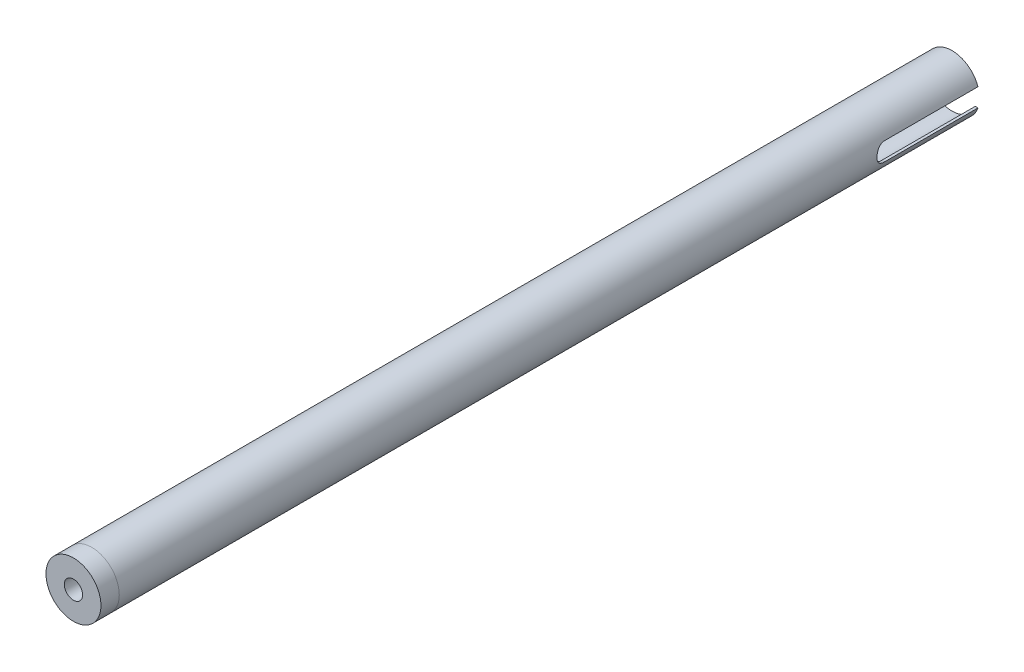
ISO-10303-21;
HEADER;
FILE_DESCRIPTION(('STEP AP214'),'2;1');
FILE_NAME('part.step','',(''),(''),'','','');
FILE_SCHEMA(('AUTOMOTIVE_DESIGN { 1 0 10303 214 1 1 1 1 }'));
ENDSEC;
DATA;
#1=APPLICATION_CONTEXT('core data for automotive mechanical design processes');
#2=APPLICATION_PROTOCOL_DEFINITION('international standard','automotive_design',2000,#1);
#3=PRODUCT_CONTEXT('',#1,'mechanical');
#4=PRODUCT('Part','Part','',(#3));
#5=PRODUCT_RELATED_PRODUCT_CATEGORY('part','',(#4));
#6=PRODUCT_DEFINITION_FORMATION('','',#4);
#7=PRODUCT_DEFINITION_CONTEXT('part definition',#1,'design');
#8=PRODUCT_DEFINITION('design','',#6,#7);
#9=PRODUCT_DEFINITION_SHAPE('','',#8);
#10=(LENGTH_UNIT() NAMED_UNIT(*) SI_UNIT(.MILLI.,.METRE.));
#11=(NAMED_UNIT(*) PLANE_ANGLE_UNIT() SI_UNIT($,.RADIAN.));
#12=(NAMED_UNIT(*) SI_UNIT($,.STERADIAN.) SOLID_ANGLE_UNIT());
#13=UNCERTAINTY_MEASURE_WITH_UNIT(LENGTH_MEASURE(1.E-05),#10,'distance_accuracy_value','');
#14=(GEOMETRIC_REPRESENTATION_CONTEXT(3) GLOBAL_UNCERTAINTY_ASSIGNED_CONTEXT((#13)) GLOBAL_UNIT_ASSIGNED_CONTEXT((#10,
#11,#12)) REPRESENTATION_CONTEXT('',''));
#15=CARTESIAN_POINT('',(0.,0.,0.));
#16=DIRECTION('',(0.,0.,1.));
#17=DIRECTION('',(1.,0.,0.));
#18=AXIS2_PLACEMENT_3D('',#15,#16,#17);
#19=CARTESIAN_POINT('',(0.,0.,-304.380065838685));
#20=DIRECTION('',(0.,0.,1.));
#21=DIRECTION('',(1.,0.,0.));
#22=AXIS2_PLACEMENT_3D('',#19,#20,#21);
#23=CYLINDRICAL_SURFACE('',#22,9.525);
#24=CARTESIAN_POINT('',(0.,0.,-6.35));
#25=DIRECTION('',(0.,0.,1.));
#26=DIRECTION('',(1.,0.,0.));
#27=AXIS2_PLACEMENT_3D('',#24,#25,#26);
#28=CIRCLE('',#27,9.525);
#29=CARTESIAN_POINT('',(9.525,0.,-6.35));
#30=VERTEX_POINT('',#29);
#31=EDGE_CURVE('E175',#30,#30,#28,.T.);
#32=ORIENTED_EDGE('',*,*,#31,.F.);
#33=EDGE_LOOP('',(#32));
#34=FACE_BOUND('',#33,.T.);
#35=CARTESIAN_POINT('',(-8.98025612106915,3.175,-271.995065838685));
#36=CARTESIAN_POINT('',(-8.98024230233901,3.17501142134308,-271.908439735349));
#37=CARTESIAN_POINT('',(-8.98150922759707,3.17145501317748,-271.821821352873));
#38=CARTESIAN_POINT('',(-8.98650170400112,3.1572955094353,-271.649256538048));
#39=CARTESIAN_POINT('',(-8.99022659113085,3.14669431699564,-271.563309930562));
#40=CARTESIAN_POINT('',(-9.00001740508998,3.11857670914845,-271.392955689397));
#41=CARTESIAN_POINT('',(-9.00607621805003,3.10108130380328,-271.30854418759));
#42=CARTESIAN_POINT('',(-9.02033586435304,3.05935434973543,-271.141609386254));
#43=CARTESIAN_POINT('',(-9.02853677497232,3.03512255799513,-271.059086154963));
#44=CARTESIAN_POINT('',(-9.05598792154067,2.95264369348964,-270.815287531686));
#45=CARTESIAN_POINT('',(-9.07810200713862,2.88457148458964,-270.657533947362));
#46=CARTESIAN_POINT('',(-9.127451360236,2.72437908867648,-270.355657428873));
#47=CARTESIAN_POINT('',(-9.15468995097455,2.63224328129309,-270.211543431645));
#48=CARTESIAN_POINT('',(-9.21240416673121,2.42269155952415,-269.93539057182));
#49=CARTESIAN_POINT('',(-9.24296008478943,2.30449853156514,-269.803956989958));
#50=CARTESIAN_POINT('',(-9.30318902123142,2.04784031127147,-269.562361693621));
#51=CARTESIAN_POINT('',(-9.33286185998227,1.90937102786997,-269.452204282389));
#52=CARTESIAN_POINT('',(-9.38892492365177,1.61159672697581,-269.253487270901));
#53=CARTESIAN_POINT('',(-9.41520772598946,1.45183792838573,-269.165575084891));
#54=CARTESIAN_POINT('',(-9.46054712430068,1.11883883316166,-269.018170358821));
#55=CARTESIAN_POINT('',(-9.47961052807859,0.945611424033788,-268.95865103082));
#56=CARTESIAN_POINT('',(-9.50410661247238,0.642992499572375,-268.883172266324));
#57=CARTESIAN_POINT('',(-9.51189798251809,0.515662964136016,-268.859554294281));
#58=CARTESIAN_POINT('',(-9.51973491912187,0.323120458247701,-268.835888028107));
#59=CARTESIAN_POINT('',(-9.52170555244691,0.258670486244991,-268.829959380491));
#60=CARTESIAN_POINT('',(-9.52433958502699,0.12948493034666,-268.822046755824));
#61=CARTESIAN_POINT('',(-9.5250026318504,0.0647492741617728,-268.820063842259));
#62=CARTESIAN_POINT('',(-9.525,0.,-268.820065838685));
#63=B_SPLINE_CURVE_WITH_KNOTS('',3,(#35,#36,#37,#38,#39,#40,#41,#42,#43,#44,#45,#46,#47,#48,#49,
#50,#51,#52,#53,#54,#55,#56,#57,#58,#59,#60,#61,#62),.UNSPECIFIED.,.F.,.F.,(4,2,2,2,2,2,2,2,2,2,
2,2,2,4),(0.,0.259783027985017,0.519495904525443,0.778423354079467,1.0373601457496,
1.55448370709133,2.07194378605916,2.60765740005743,3.14347925237348,3.69345572792671,
4.24291228331228,4.63105001394513,4.82518498412947,5.01937227204625),.UNSPECIFIED.);
#64=CARTESIAN_POINT('',(-8.98025612106915,3.175,-271.995065838685));
#65=VERTEX_POINT('',#64);
#66=CARTESIAN_POINT('',(-9.525,0.,-268.820065838685));
#67=VERTEX_POINT('',#66);
#68=EDGE_CURVE('E209',#65,#67,#63,.T.);
#69=ORIENTED_EDGE('',*,*,#68,.T.);
#70=CARTESIAN_POINT('',(-9.525,0.,-268.820065838685));
#71=CARTESIAN_POINT('',(-9.52501110102584,-0.0867614879611049,-268.820054733648));
#72=CARTESIAN_POINT('',(-9.52381482114642,-0.173516026970688,-268.823621945305));
#73=CARTESIAN_POINT('',(-9.51909010104991,-0.346361025979108,-268.837826783887));
#74=CARTESIAN_POINT('',(-9.51556219632442,-0.432451633867625,-268.848462787364));
#75=CARTESIAN_POINT('',(-9.50626969526085,-0.603121388983434,-268.876679778878));
#76=CARTESIAN_POINT('',(-9.50051134567603,-0.687704073408645,-268.894241373046));
#77=CARTESIAN_POINT('',(-9.48692170416637,-0.854983898510573,-268.936132693684));
#78=CARTESIAN_POINT('',(-9.47909035815865,-0.937680989932473,-268.960462596734));
#79=CARTESIAN_POINT('',(-9.45278540829331,-1.18202731628102,-269.043296989672));
#80=CARTESIAN_POINT('',(-9.43148823554423,-1.3401498669332,-269.111682671018));
#81=CARTESIAN_POINT('',(-9.38354405256208,-1.64264414222568,-269.272609196794));
#82=CARTESIAN_POINT('',(-9.35689419571071,-1.78700848960572,-269.365162901948));
#83=CARTESIAN_POINT('',(-9.30002401422067,-2.06291632995428,-269.575156330153));
#84=CARTESIAN_POINT('',(-9.26971861159363,-2.19392359690275,-269.693278615572));
#85=CARTESIAN_POINT('',(-9.20941732427212,-2.43468689521899,-269.949616592407));
#86=CARTESIAN_POINT('',(-9.1794215361322,-2.54443647619593,-270.087838360565));
#87=CARTESIAN_POINT('',(-9.122187697517,-2.74268087840455,-270.385346339613));
#88=CARTESIAN_POINT('',(-9.09505529775998,-2.83046425019681,-270.545128477686));
#89=CARTESIAN_POINT('',(-9.04794936227173,-2.9776233718293,-270.878172799691));
#90=CARTESIAN_POINT('',(-9.0279682579705,-3.03702917747985,-271.051420494499));
#91=CARTESIAN_POINT('',(-9.00226999890487,-3.1122125650425,-271.353707528494));
#92=CARTESIAN_POINT('',(-8.99408207355733,-3.13569679171672,-271.480669849921));
#93=CARTESIAN_POINT('',(-8.98304472933549,-3.16711304593222,-271.73674702169));
#94=CARTESIAN_POINT('',(-8.98019613476149,-3.17504267212105,-271.865862201292));
#95=CARTESIAN_POINT('',(-8.98025612106915,-3.175,-271.995065838685));
#96=B_SPLINE_CURVE_WITH_KNOTS('',3,(#70,#71,#72,#73,#74,#75,#76,#77,#78,#79,#80,#81,#82,#83,#84,
#85,#86,#87,#88,#89,#90,#91,#92,#93,#94,#95),.UNSPECIFIED.,.F.,.F.,(4,2,2,2,2,2,2,2,2,2,2,2,4),
(0.,0.260191091827307,0.52032244773723,0.77973046721251,1.03914525511038,1.55731822615721,
2.07576750062865,2.61028978360824,3.14497400776474,3.6952175213376,4.24487695078963,
4.63199348452988,5.01916977744542),.UNSPECIFIED.);
#97=CARTESIAN_POINT('',(-8.98025612106916,-3.175,-271.995065838685));
#98=VERTEX_POINT('',#97);
#99=EDGE_CURVE('E151',#67,#98,#96,.T.);
#100=ORIENTED_EDGE('',*,*,#99,.T.);
#101=DIRECTION('',(0.,0.,-1.));
#102=VECTOR('',#101,1.);
#103=CARTESIAN_POINT('',(-8.98025612106916,-3.175,-268.820065838685));
#104=LINE('',#103,#102);
#105=CARTESIAN_POINT('',(-8.98025612106916,-3.175,-304.380065838685));
#106=VERTEX_POINT('',#105);
#107=EDGE_CURVE('E146',#98,#106,#104,.T.);
#108=ORIENTED_EDGE('',*,*,#107,.T.);
#109=CARTESIAN_POINT('',(0.,0.,-304.380065838685));
#110=DIRECTION('',(0.,0.,1.));
#111=DIRECTION('',(1.,0.,0.));
#112=AXIS2_PLACEMENT_3D('',#109,#110,#111);
#113=CIRCLE('',#112,9.525);
#114=CARTESIAN_POINT('',(8.98025612106915,-3.175,-304.380065838685));
#115=VERTEX_POINT('',#114);
#116=EDGE_CURVE('E149',#106,#115,#113,.T.);
#117=ORIENTED_EDGE('',*,*,#116,.T.);
#118=DIRECTION('',(0.,0.,-1.));
#119=VECTOR('',#118,1.);
#120=CARTESIAN_POINT('',(8.98025612106915,-3.175,-268.820065838685));
#121=LINE('',#120,#119);
#122=CARTESIAN_POINT('',(8.98025612106915,-3.175,-271.995065838685));
#123=VERTEX_POINT('',#122);
#124=EDGE_CURVE('E459',#123,#115,#121,.T.);
#125=ORIENTED_EDGE('',*,*,#124,.F.);
#126=CARTESIAN_POINT('',(8.98025612106915,-3.175,-271.995065838685));
#127=CARTESIAN_POINT('',(8.98024230233901,-3.17501142134308,-271.908439735349));
#128=CARTESIAN_POINT('',(8.98150922759707,-3.17145501317748,-271.821821352873));
#129=CARTESIAN_POINT('',(8.98650170400112,-3.1572955094353,-271.649256538048));
#130=CARTESIAN_POINT('',(8.99022659113085,-3.14669431699564,-271.563309930562));
#131=CARTESIAN_POINT('',(9.00001740508998,-3.11857670914845,-271.392955689397));
#132=CARTESIAN_POINT('',(9.00607621805003,-3.10108130380328,-271.30854418759));
#133=CARTESIAN_POINT('',(9.02033586435304,-3.05935434973543,-271.141609386254));
#134=CARTESIAN_POINT('',(9.02853677497232,-3.03512255799513,-271.059086154963));
#135=CARTESIAN_POINT('',(9.05598792154067,-2.95264369348964,-270.815287531686));
#136=CARTESIAN_POINT('',(9.07810200713862,-2.88457148458964,-270.657533947362));
#137=CARTESIAN_POINT('',(9.127451360236,-2.72437908867648,-270.355657428873));
#138=CARTESIAN_POINT('',(9.15468995097455,-2.63224328129309,-270.211543431645));
#139=CARTESIAN_POINT('',(9.21240416673121,-2.42269155952415,-269.93539057182));
#140=CARTESIAN_POINT('',(9.24296008478943,-2.30449853156514,-269.803956989958));
#141=CARTESIAN_POINT('',(9.30318902123142,-2.04784031127147,-269.562361693621));
#142=CARTESIAN_POINT('',(9.33286185998227,-1.90937102786997,-269.452204282389));
#143=CARTESIAN_POINT('',(9.38892492365177,-1.61159672697581,-269.253487270901));
#144=CARTESIAN_POINT('',(9.41520772598946,-1.45183792838573,-269.165575084891));
#145=CARTESIAN_POINT('',(9.46054712430068,-1.11883883316166,-269.018170358821));
#146=CARTESIAN_POINT('',(9.47961052807859,-0.945611424033788,-268.95865103082));
#147=CARTESIAN_POINT('',(9.50410661247238,-0.642992499572375,-268.883172266324));
#148=CARTESIAN_POINT('',(9.51189798251809,-0.515662964136016,-268.859554294281));
#149=CARTESIAN_POINT('',(9.51973491912187,-0.323120458247701,-268.835888028107));
#150=CARTESIAN_POINT('',(9.52170555244691,-0.258670486244991,-268.829959380491));
#151=CARTESIAN_POINT('',(9.52433958502699,-0.12948493034666,-268.822046755824));
#152=CARTESIAN_POINT('',(9.5250026318504,-0.0647492741617728,-268.820063842259));
#153=CARTESIAN_POINT('',(9.525,0.,-268.820065838685));
#154=B_SPLINE_CURVE_WITH_KNOTS('',3,(#126,#127,#128,#129,#130,#131,#132,#133,#134,#135,#136,
#137,#138,#139,#140,#141,#142,#143,#144,#145,#146,#147,#148,#149,#150,#151,#152,#153),
.UNSPECIFIED.,.F.,.F.,(4,2,2,2,2,2,2,2,2,2,2,2,2,4),(0.,0.259783027985017,0.519495904525443,
0.778423354079467,1.0373601457496,1.55448370709133,2.07194378605916,2.60765740005743,
3.14347925237348,3.69345572792671,4.24291228331228,4.63105001394513,4.82518498412947,
5.01937227204625),.UNSPECIFIED.);
#155=CARTESIAN_POINT('',(9.525,0.,-268.820065838685));
#156=VERTEX_POINT('',#155);
#157=EDGE_CURVE('E92',#123,#156,#154,.T.);
#158=ORIENTED_EDGE('',*,*,#157,.T.);
#159=CARTESIAN_POINT('',(9.525,0.,-268.820065838685));
#160=CARTESIAN_POINT('',(9.52501110102584,0.0867614879611049,-268.820054733648));
#161=CARTESIAN_POINT('',(9.52381482114642,0.173516026970688,-268.823621945305));
#162=CARTESIAN_POINT('',(9.51909010104991,0.346361025979108,-268.837826783887));
#163=CARTESIAN_POINT('',(9.51556219632442,0.432451633867625,-268.848462787364));
#164=CARTESIAN_POINT('',(9.50626969526085,0.603121388983434,-268.876679778878));
#165=CARTESIAN_POINT('',(9.50051134567603,0.687704073408645,-268.894241373046));
#166=CARTESIAN_POINT('',(9.48692170416637,0.854983898510573,-268.936132693684));
#167=CARTESIAN_POINT('',(9.47909035815865,0.937680989932473,-268.960462596734));
#168=CARTESIAN_POINT('',(9.45278540829331,1.18202731628102,-269.043296989672));
#169=CARTESIAN_POINT('',(9.43148823554423,1.3401498669332,-269.111682671018));
#170=CARTESIAN_POINT('',(9.38354405256208,1.64264414222568,-269.272609196794));
#171=CARTESIAN_POINT('',(9.35689419571071,1.78700848960572,-269.365162901948));
#172=CARTESIAN_POINT('',(9.30002401422067,2.06291632995428,-269.575156330153));
#173=CARTESIAN_POINT('',(9.26971861159363,2.19392359690275,-269.693278615572));
#174=CARTESIAN_POINT('',(9.20941732427212,2.43468689521899,-269.949616592407));
#175=CARTESIAN_POINT('',(9.1794215361322,2.54443647619593,-270.087838360565));
#176=CARTESIAN_POINT('',(9.122187697517,2.74268087840455,-270.385346339613));
#177=CARTESIAN_POINT('',(9.09505529775998,2.83046425019681,-270.545128477686));
#178=CARTESIAN_POINT('',(9.04794936227173,2.9776233718293,-270.878172799691));
#179=CARTESIAN_POINT('',(9.0279682579705,3.03702917747985,-271.051420494499));
#180=CARTESIAN_POINT('',(9.00226999890487,3.1122125650425,-271.353707528494));
#181=CARTESIAN_POINT('',(8.99408207355733,3.13569679171672,-271.480669849921));
#182=CARTESIAN_POINT('',(8.98304472933549,3.16711304593222,-271.73674702169));
#183=CARTESIAN_POINT('',(8.98019613476149,3.17504267212105,-271.865862201292));
#184=CARTESIAN_POINT('',(8.98025612106915,3.175,-271.995065838685));
#185=B_SPLINE_CURVE_WITH_KNOTS('',3,(#159,#160,#161,#162,#163,#164,#165,#166,#167,#168,#169,
#170,#171,#172,#173,#174,#175,#176,#177,#178,#179,#180,#181,#182,#183,#184),.UNSPECIFIED.,.F.,
.F.,(4,2,2,2,2,2,2,2,2,2,2,2,4),(0.,0.260191091827307,0.52032244773723,0.77973046721251,
1.03914525511038,1.55731822615721,2.07576750062865,2.61028978360824,3.14497400776474,
3.6952175213376,4.24487695078963,4.63199348452988,5.01916977744542),.UNSPECIFIED.);
#186=CARTESIAN_POINT('',(8.98025612106915,3.175,-271.995065838685));
#187=VERTEX_POINT('',#186);
#188=EDGE_CURVE('E78',#156,#187,#185,.T.);
#189=ORIENTED_EDGE('',*,*,#188,.T.);
#190=DIRECTION('',(0.,0.,-1.));
#191=VECTOR('',#190,1.);
#192=CARTESIAN_POINT('',(8.98025612106915,3.175,-268.820065838685));
#193=LINE('',#192,#191);
#194=CARTESIAN_POINT('',(8.98025612106915,3.175,-304.380065838685));
#195=VERTEX_POINT('',#194);
#196=EDGE_CURVE('E167',#187,#195,#193,.T.);
#197=ORIENTED_EDGE('',*,*,#196,.T.);
#198=CARTESIAN_POINT('',(-8.98025612106915,3.175,-304.380065838685));
#199=VERTEX_POINT('',#198);
#200=EDGE_CURVE('E174',#195,#199,#113,.T.);
#201=ORIENTED_EDGE('',*,*,#200,.T.);
#202=DIRECTION('',(0.,0.,-1.));
#203=VECTOR('',#202,1.);
#204=CARTESIAN_POINT('',(-8.98025612106915,3.175,-268.820065838685));
#205=LINE('',#204,#203);
#206=EDGE_CURVE('E448',#65,#199,#205,.T.);
#207=ORIENTED_EDGE('',*,*,#206,.F.);
#208=EDGE_LOOP('',(#69,#100,#108,#117,#125,#158,#189,#197,#201,#207));
#209=FACE_BOUND('',#208,.T.);
#210=ADVANCED_FACE('F67',(#34,#209),#23,.T.);
#211=CARTESIAN_POINT('',(0.,0.,-304.380065838685));
#212=DIRECTION('',(0.,0.,1.));
#213=DIRECTION('',(1.,0.,0.));
#214=AXIS2_PLACEMENT_3D('',#211,#212,#213);
#215=PLANE('',#214);
#216=DIRECTION('',(1.,0.,0.));
#217=VECTOR('',#216,1.);
#218=CARTESIAN_POINT('',(0.,-3.175,-304.380065838685));
#219=LINE('',#218,#217);
#220=CARTESIAN_POINT('',(-8.03118117091129,-3.175,-304.380065838685));
#221=VERTEX_POINT('',#220);
#222=EDGE_CURVE('E159',#106,#221,#219,.T.);
#223=ORIENTED_EDGE('',*,*,#222,.T.);
#224=CARTESIAN_POINT('',(0.,0.,-304.380065838685));
#225=DIRECTION('',(0.,0.,1.));
#226=DIRECTION('',(1.,0.,0.));
#227=AXIS2_PLACEMENT_3D('',#224,#225,#226);
#228=CIRCLE('',#227,8.636);
#229=CARTESIAN_POINT('',(8.03118117091129,-3.175,-304.380065838685));
#230=VERTEX_POINT('',#229);
#231=EDGE_CURVE('E300',#221,#230,#228,.T.);
#232=ORIENTED_EDGE('',*,*,#231,.T.);
#233=DIRECTION('',(1.,0.,0.));
#234=VECTOR('',#233,1.);
#235=CARTESIAN_POINT('',(0.,-3.175,-304.380065838685));
#236=LINE('',#235,#234);
#237=EDGE_CURVE('E172',#230,#115,#236,.T.);
#238=ORIENTED_EDGE('',*,*,#237,.T.);
#239=ORIENTED_EDGE('',*,*,#116,.F.);
#240=EDGE_LOOP('',(#223,#232,#238,#239));
#241=FACE_BOUND('',#240,.T.);
#242=ADVANCED_FACE('F170',(#241),#215,.F.);
#243=CARTESIAN_POINT('',(0.,0.,-304.380065838685));
#244=DIRECTION('',(0.,0.,1.));
#245=DIRECTION('',(1.,0.,0.));
#246=AXIS2_PLACEMENT_3D('',#243,#244,#245);
#247=CYLINDRICAL_SURFACE('',#246,8.636);
#248=CARTESIAN_POINT('',(0.,0.,-6.35));
#249=DIRECTION('',(0.,0.,1.));
#250=DIRECTION('',(1.,0.,0.));
#251=AXIS2_PLACEMENT_3D('',#248,#249,#250);
#252=CIRCLE('',#251,8.636);
#253=CARTESIAN_POINT('',(8.636,0.,-6.35));
#254=VERTEX_POINT('',#253);
#255=EDGE_CURVE('E155',#254,#254,#252,.T.);
#256=ORIENTED_EDGE('',*,*,#255,.T.);
#257=EDGE_LOOP('',(#256));
#258=FACE_BOUND('',#257,.T.);
#259=DIRECTION('',(0.,0.,-1.));
#260=VECTOR('',#259,1.);
#261=CARTESIAN_POINT('',(-8.03118117091129,-3.175,-268.820065838685));
#262=LINE('',#261,#260);
#263=CARTESIAN_POINT('',(-8.03118117091129,-3.175,-271.995065838685));
#264=VERTEX_POINT('',#263);
#265=EDGE_CURVE('E156',#264,#221,#262,.T.);
#266=ORIENTED_EDGE('',*,*,#265,.F.);
#267=CARTESIAN_POINT('',(-8.03118117091129,-3.175,-271.995065838685));
#268=CARTESIAN_POINT('',(-8.03116550357192,-3.17501203663229,-271.909030870569));
#269=CARTESIAN_POINT('',(-8.03256328665432,-3.17150327993899,-271.82300451804));
#270=CARTESIAN_POINT('',(-8.03806891362409,-3.15753809299539,-271.651631947571));
#271=CARTESIAN_POINT('',(-8.04217588089716,-3.14708391007799,-271.566285518665));
#272=CARTESIAN_POINT('',(-8.05296421917626,-3.11937037021479,-271.39717638445));
#273=CARTESIAN_POINT('',(-8.05963650808001,-3.10213501593152,-271.313409173507));
#274=CARTESIAN_POINT('',(-8.07533202922414,-3.06104389654164,-271.147760210739));
#275=CARTESIAN_POINT('',(-8.08435537430867,-3.0371878136549,-271.06587854962));
#276=CARTESIAN_POINT('',(-8.11453837074661,-2.95603278100127,-270.824026392375));
#277=CARTESIAN_POINT('',(-8.13883087950844,-2.88909903597752,-270.6675597548));
#278=CARTESIAN_POINT('',(-8.19300406693486,-2.73167948818753,-270.368024765675));
#279=CARTESIAN_POINT('',(-8.22288931448619,-2.64117440539563,-270.224967513118));
#280=CARTESIAN_POINT('',(-8.28646461334555,-2.43457537576576,-269.94949710388));
#281=CARTESIAN_POINT('',(-8.32026315150129,-2.317546455696,-269.817808731793));
#282=CARTESIAN_POINT('',(-8.38695072719909,-2.06320558041454,-269.5754205534));
#283=CARTESIAN_POINT('',(-8.41983956911545,-1.9258893021522,-269.464725232029));
#284=CARTESIAN_POINT('',(-8.48230406273647,-1.62932475427477,-269.263944117079));
#285=CARTESIAN_POINT('',(-8.5117351959247,-1.46950375402868,-269.174655763574));
#286=CARTESIAN_POINT('',(-8.56262575627031,-1.13591027783605,-269.02459361061));
#287=CARTESIAN_POINT('',(-8.58409342507971,-0.962152453429211,-268.96379031379));
#288=CARTESIAN_POINT('',(-8.61197450421744,-0.656412542712579,-268.88586594814));
#289=CARTESIAN_POINT('',(-8.62092967235125,-0.526538210349253,-268.861250163802));
#290=CARTESIAN_POINT('',(-8.62994176115801,-0.33002097693851,-268.836572832086));
#291=CARTESIAN_POINT('',(-8.63220903333296,-0.264206342476355,-268.830388092936));
#292=CARTESIAN_POINT('',(-8.63523992352765,-0.132266265743979,-268.82213287749));
#293=CARTESIAN_POINT('',(-8.6360031097792,-0.0661407396870706,-268.820063582587));
#294=CARTESIAN_POINT('',(-8.636,0.,-268.820065838685));
#295=B_SPLINE_CURVE_WITH_KNOTS('',3,(#267,#268,#269,#270,#271,#272,#273,#274,#275,#276,#277,
#278,#279,#280,#281,#282,#283,#284,#285,#286,#287,#288,#289,#290,#291,#292,#293,#294),
.UNSPECIFIED.,.F.,.F.,(4,2,2,2,2,2,2,2,2,2,2,2,2,4),(0.,0.258007583993629,0.515931725057005,
0.77295101340558,1.02998264023838,1.54317615093284,2.05679075055082,2.59254838663378,
3.128420352877,3.6819142239817,4.23483365719865,4.63113823379683,4.82943692106888,
5.02779252437178),.UNSPECIFIED.);
#296=CARTESIAN_POINT('',(-8.636,0.,-268.820065838685));
#297=VERTEX_POINT('',#296);
#298=EDGE_CURVE('E236',#264,#297,#295,.T.);
#299=ORIENTED_EDGE('',*,*,#298,.T.);
#300=CARTESIAN_POINT('',(-8.636,0.,-268.820065838685));
#301=CARTESIAN_POINT('',(-8.63601200177566,0.0862340545028663,-268.820054264962));
#302=CARTESIAN_POINT('',(-8.63470866649585,0.172460638964016,-268.823578804982));
#303=CARTESIAN_POINT('',(-8.62956076290727,0.344245368623961,-268.837610234612));
#304=CARTESIAN_POINT('',(-8.62571686385256,0.429803683858972,-268.848115285368));
#305=CARTESIAN_POINT('',(-8.61559314175803,0.599377201936824,-268.875974039423));
#306=CARTESIAN_POINT('',(-8.60932102288695,0.683396413719317,-268.893306085279));
#307=CARTESIAN_POINT('',(-8.5945171663722,0.849553539449469,-268.934637308555));
#308=CARTESIAN_POINT('',(-8.58598535382315,0.93169139093483,-268.958636706988));
#309=CARTESIAN_POINT('',(-8.55732464851214,1.17435074221828,-269.040310888426));
#310=CARTESIAN_POINT('',(-8.53411500636261,1.33136171263578,-269.107702209392));
#311=CARTESIAN_POINT('',(-8.48180653117632,1.63181198358795,-269.266193919402));
#312=CARTESIAN_POINT('',(-8.45270389942466,1.77524244193608,-269.357309612439));
#313=CARTESIAN_POINT('',(-8.39029834803106,2.05036661398532,-269.564562730117));
#314=CARTESIAN_POINT('',(-8.35688032192871,2.1814347411356,-269.681497097709));
#315=CARTESIAN_POINT('',(-8.29018507770489,2.42260670191496,-269.935386084166));
#316=CARTESIAN_POINT('',(-8.25690791509208,2.53270290926749,-270.072347953996));
#317=CARTESIAN_POINT('',(-8.19291826363247,2.73277128594141,-270.368513042821));
#318=CARTESIAN_POINT('',(-8.16234475412034,2.82185641770732,-270.528348132258));
#319=CARTESIAN_POINT('',(-8.10906121054024,2.97153048258984,-270.86194347576));
#320=CARTESIAN_POINT('',(-8.08634169503735,3.03215380703845,-271.035686625429));
#321=CARTESIAN_POINT('',(-8.05677760160867,3.10966172606007,-271.340955260242));
#322=CARTESIAN_POINT('',(-8.04725077861386,3.13409804308655,-271.470335979448));
#323=CARTESIAN_POINT('',(-8.03764862425496,3.15860280233702,-271.666143105288));
#324=CARTESIAN_POINT('',(-8.0352292163598,3.16474613160121,-271.731735861594));
#325=CARTESIAN_POINT('',(-8.03199317651195,3.17294655384153,-271.863235813984));
#326=CARTESIAN_POINT('',(-8.03117703985816,3.17500238406813,-271.929143100934));
#327=CARTESIAN_POINT('',(-8.03118117091129,3.175,-271.995065838685));
#328=B_SPLINE_CURVE_WITH_KNOTS('',3,(#300,#301,#302,#303,#304,#305,#306,#307,#308,#309,#310,
#311,#312,#313,#314,#315,#316,#317,#318,#319,#320,#321,#322,#323,#324,#325,#326,#327),
.UNSPECIFIED.,.F.,.F.,(4,2,2,2,2,2,2,2,2,2,2,2,2,4),(0.,0.25860768427724,0.517147271349144,
0.774873208333403,1.03260768960759,1.54734347080468,2.06241212125685,2.59642224394461,
3.13062618611955,3.6844391606936,4.23758121159796,4.63245186558862,4.83009172977028,
5.0277926412787),.UNSPECIFIED.);
#329=CARTESIAN_POINT('',(-8.03118117091129,3.175,-271.995065838685));
#330=VERTEX_POINT('',#329);
#331=EDGE_CURVE('E200',#297,#330,#328,.T.);
#332=ORIENTED_EDGE('',*,*,#331,.T.);
#333=DIRECTION('',(0.,0.,-1.));
#334=VECTOR('',#333,1.);
#335=CARTESIAN_POINT('',(-8.03118117091129,3.175,-268.820065838685));
#336=LINE('',#335,#334);
#337=CARTESIAN_POINT('',(-8.03118117091129,3.175,-304.380065838685));
#338=VERTEX_POINT('',#337);
#339=EDGE_CURVE('E444',#330,#338,#336,.T.);
#340=ORIENTED_EDGE('',*,*,#339,.T.);
#341=CARTESIAN_POINT('',(8.03118117091129,3.175,-304.380065838685));
#342=VERTEX_POINT('',#341);
#343=EDGE_CURVE('E182',#342,#338,#228,.T.);
#344=ORIENTED_EDGE('',*,*,#343,.F.);
#345=DIRECTION('',(0.,0.,-1.));
#346=VECTOR('',#345,1.);
#347=CARTESIAN_POINT('',(8.03118117091129,3.175,-268.820065838685));
#348=LINE('',#347,#346);
#349=CARTESIAN_POINT('',(8.03118117091129,3.175,-271.995065838685));
#350=VERTEX_POINT('',#349);
#351=EDGE_CURVE('E292',#350,#342,#348,.T.);
#352=ORIENTED_EDGE('',*,*,#351,.F.);
#353=CARTESIAN_POINT('',(8.03118117091129,3.175,-271.995065838685));
#354=CARTESIAN_POINT('',(8.03116550357192,3.17501203663229,-271.909030870569));
#355=CARTESIAN_POINT('',(8.03256328665432,3.17150327993899,-271.82300451804));
#356=CARTESIAN_POINT('',(8.03806891362409,3.15753809299539,-271.651631947571));
#357=CARTESIAN_POINT('',(8.04217588089716,3.14708391007799,-271.566285518665));
#358=CARTESIAN_POINT('',(8.05296421917626,3.11937037021479,-271.39717638445));
#359=CARTESIAN_POINT('',(8.05963650808001,3.10213501593152,-271.313409173507));
#360=CARTESIAN_POINT('',(8.07533202922414,3.06104389654164,-271.147760210739));
#361=CARTESIAN_POINT('',(8.08435537430867,3.0371878136549,-271.06587854962));
#362=CARTESIAN_POINT('',(8.11453837074661,2.95603278100127,-270.824026392375));
#363=CARTESIAN_POINT('',(8.13883087950844,2.88909903597752,-270.6675597548));
#364=CARTESIAN_POINT('',(8.19300406693486,2.73167948818753,-270.368024765675));
#365=CARTESIAN_POINT('',(8.22288931448619,2.64117440539563,-270.224967513118));
#366=CARTESIAN_POINT('',(8.28646461334555,2.43457537576576,-269.94949710388));
#367=CARTESIAN_POINT('',(8.32026315150129,2.317546455696,-269.817808731793));
#368=CARTESIAN_POINT('',(8.38695072719909,2.06320558041454,-269.5754205534));
#369=CARTESIAN_POINT('',(8.41983956911545,1.9258893021522,-269.464725232029));
#370=CARTESIAN_POINT('',(8.48230406273647,1.62932475427477,-269.263944117079));
#371=CARTESIAN_POINT('',(8.5117351959247,1.46950375402868,-269.174655763574));
#372=CARTESIAN_POINT('',(8.56262575627031,1.13591027783605,-269.02459361061));
#373=CARTESIAN_POINT('',(8.58409342507971,0.962152453429211,-268.96379031379));
#374=CARTESIAN_POINT('',(8.61197450421744,0.656412542712579,-268.88586594814));
#375=CARTESIAN_POINT('',(8.62092967235125,0.526538210349253,-268.861250163802));
#376=CARTESIAN_POINT('',(8.62994176115801,0.33002097693851,-268.836572832086));
#377=CARTESIAN_POINT('',(8.63220903333296,0.264206342476355,-268.830388092936));
#378=CARTESIAN_POINT('',(8.63523992352765,0.132266265743979,-268.82213287749));
#379=CARTESIAN_POINT('',(8.6360031097792,0.0661407396870706,-268.820063582587));
#380=CARTESIAN_POINT('',(8.636,0.,-268.820065838685));
#381=B_SPLINE_CURVE_WITH_KNOTS('',3,(#353,#354,#355,#356,#357,#358,#359,#360,#361,#362,#363,
#364,#365,#366,#367,#368,#369,#370,#371,#372,#373,#374,#375,#376,#377,#378,#379,#380),
.UNSPECIFIED.,.F.,.F.,(4,2,2,2,2,2,2,2,2,2,2,2,2,4),(0.,0.258007583993629,0.515931725057005,
0.77295101340558,1.02998264023838,1.54317615093284,2.05679075055082,2.59254838663378,
3.128420352877,3.6819142239817,4.23483365719865,4.63113823379683,4.82943692106888,
5.02779252437178),.UNSPECIFIED.);
#382=CARTESIAN_POINT('',(8.636,0.,-268.820065838685));
#383=VERTEX_POINT('',#382);
#384=EDGE_CURVE('E13',#350,#383,#381,.T.);
#385=ORIENTED_EDGE('',*,*,#384,.T.);
#386=CARTESIAN_POINT('',(8.636,0.,-268.820065838685));
#387=CARTESIAN_POINT('',(8.63601200177566,-0.0862340545028663,-268.820054264962));
#388=CARTESIAN_POINT('',(8.63470866649585,-0.172460638964016,-268.823578804982));
#389=CARTESIAN_POINT('',(8.62956076290727,-0.344245368623961,-268.837610234612));
#390=CARTESIAN_POINT('',(8.62571686385256,-0.429803683858972,-268.848115285368));
#391=CARTESIAN_POINT('',(8.61559314175803,-0.599377201936824,-268.875974039423));
#392=CARTESIAN_POINT('',(8.60932102288695,-0.683396413719317,-268.893306085279));
#393=CARTESIAN_POINT('',(8.5945171663722,-0.849553539449469,-268.934637308555));
#394=CARTESIAN_POINT('',(8.58598535382315,-0.93169139093483,-268.958636706988));
#395=CARTESIAN_POINT('',(8.55732464851214,-1.17435074221828,-269.040310888426));
#396=CARTESIAN_POINT('',(8.53411500636261,-1.33136171263578,-269.107702209392));
#397=CARTESIAN_POINT('',(8.48180653117632,-1.63181198358795,-269.266193919402));
#398=CARTESIAN_POINT('',(8.45270389942466,-1.77524244193608,-269.357309612439));
#399=CARTESIAN_POINT('',(8.39029834803106,-2.05036661398532,-269.564562730117));
#400=CARTESIAN_POINT('',(8.35688032192871,-2.1814347411356,-269.681497097709));
#401=CARTESIAN_POINT('',(8.29018507770489,-2.42260670191496,-269.935386084166));
#402=CARTESIAN_POINT('',(8.25690791509208,-2.53270290926749,-270.072347953996));
#403=CARTESIAN_POINT('',(8.19291826363247,-2.73277128594141,-270.368513042821));
#404=CARTESIAN_POINT('',(8.16234475412034,-2.82185641770732,-270.528348132258));
#405=CARTESIAN_POINT('',(8.10906121054024,-2.97153048258984,-270.86194347576));
#406=CARTESIAN_POINT('',(8.08634169503735,-3.03215380703845,-271.035686625429));
#407=CARTESIAN_POINT('',(8.05677760160867,-3.10966172606007,-271.340955260242));
#408=CARTESIAN_POINT('',(8.04725077861386,-3.13409804308655,-271.470335979448));
#409=CARTESIAN_POINT('',(8.03764862425496,-3.15860280233702,-271.666143105288));
#410=CARTESIAN_POINT('',(8.0352292163598,-3.16474613160121,-271.731735861594));
#411=CARTESIAN_POINT('',(8.03199317651195,-3.17294655384153,-271.863235813984));
#412=CARTESIAN_POINT('',(8.03117703985816,-3.17500238406813,-271.929143100934));
#413=CARTESIAN_POINT('',(8.03118117091129,-3.175,-271.995065838685));
#414=B_SPLINE_CURVE_WITH_KNOTS('',3,(#386,#387,#388,#389,#390,#391,#392,#393,#394,#395,#396,
#397,#398,#399,#400,#401,#402,#403,#404,#405,#406,#407,#408,#409,#410,#411,#412,#413),
.UNSPECIFIED.,.F.,.F.,(4,2,2,2,2,2,2,2,2,2,2,2,2,4),(0.,0.25860768427724,0.517147271349144,
0.774873208333403,1.03260768960759,1.54734347080468,2.06241212125685,2.59642224394461,
3.13062618611955,3.6844391606936,4.23758121159796,4.63245186558862,4.83009172977028,
5.0277926412787),.UNSPECIFIED.);
#415=CARTESIAN_POINT('',(8.03118117091129,-3.175,-271.995065838685));
#416=VERTEX_POINT('',#415);
#417=EDGE_CURVE('E254',#383,#416,#414,.T.);
#418=ORIENTED_EDGE('',*,*,#417,.T.);
#419=DIRECTION('',(0.,0.,-1.));
#420=VECTOR('',#419,1.);
#421=CARTESIAN_POINT('',(8.03118117091129,-3.175,-268.820065838685));
#422=LINE('',#421,#420);
#423=EDGE_CURVE('E295',#416,#230,#422,.T.);
#424=ORIENTED_EDGE('',*,*,#423,.T.);
#425=ORIENTED_EDGE('',*,*,#231,.F.);
#426=EDGE_LOOP('',(#266,#299,#332,#340,#344,#352,#385,#418,#424,#425));
#427=FACE_BOUND('',#426,.T.);
#428=ADVANCED_FACE('F216',(#258,#427),#247,.F.);
#429=ORIENTED_EDGE('',*,*,#343,.T.);
#430=DIRECTION('',(1.,0.,0.));
#431=VECTOR('',#430,1.);
#432=CARTESIAN_POINT('',(0.,3.175,-304.380065838685));
#433=LINE('',#432,#431);
#434=EDGE_CURVE('E166',#199,#338,#433,.T.);
#435=ORIENTED_EDGE('',*,*,#434,.F.);
#436=ORIENTED_EDGE('',*,*,#200,.F.);
#437=DIRECTION('',(1.,0.,0.));
#438=VECTOR('',#437,1.);
#439=CARTESIAN_POINT('',(0.,3.175,-304.380065838685));
#440=LINE('',#439,#438);
#441=EDGE_CURVE('E273',#342,#195,#440,.T.);
#442=ORIENTED_EDGE('',*,*,#441,.F.);
#443=EDGE_LOOP('',(#429,#435,#436,#442));
#444=FACE_BOUND('',#443,.T.);
#445=ADVANCED_FACE('F313',(#444),#215,.F.);
#446=CARTESIAN_POINT('',(0.,0.,-6.35));
#447=DIRECTION('',(0.,0.,1.));
#448=DIRECTION('',(1.,0.,0.));
#449=AXIS2_PLACEMENT_3D('',#446,#447,#448);
#450=PLANE('',#449);
#451=ORIENTED_EDGE('',*,*,#255,.F.);
#452=EDGE_LOOP('',(#451));
#453=FACE_BOUND('',#452,.T.);
#454=ORIENTED_EDGE('',*,*,#31,.T.);
#455=EDGE_LOOP('',(#454));
#456=FACE_BOUND('',#455,.T.);
#457=ADVANCED_FACE('F310',(#453,#456),#450,.T.);
#458=CARTESIAN_POINT('',(0.,3.175,-268.820065838685));
#459=DIRECTION('',(0.,1.,0.));
#460=DIRECTION('',(0.,0.,1.));
#461=AXIS2_PLACEMENT_3D('',#458,#459,#460);
#462=PLANE('',#461);
#463=ORIENTED_EDGE('',*,*,#196,.F.);
#464=DIRECTION('',(1.,0.,0.));
#465=VECTOR('',#464,1.);
#466=CARTESIAN_POINT('',(8.03118117091129,3.175,-271.995065838685));
#467=LINE('',#466,#465);
#468=EDGE_CURVE('E197',#187,#350,#467,.F.);
#469=ORIENTED_EDGE('',*,*,#468,.T.);
#470=ORIENTED_EDGE('',*,*,#351,.T.);
#471=ORIENTED_EDGE('',*,*,#441,.T.);
#472=EDGE_LOOP('',(#463,#469,#470,#471));
#473=FACE_BOUND('',#472,.T.);
#474=ADVANCED_FACE('F288',(#473),#462,.F.);
#475=CARTESIAN_POINT('',(0.,-3.175,-268.820065838685));
#476=DIRECTION('',(0.,1.,0.));
#477=DIRECTION('',(0.,0.,1.));
#478=AXIS2_PLACEMENT_3D('',#475,#476,#477);
#479=PLANE('',#478);
#480=ORIENTED_EDGE('',*,*,#423,.F.);
#481=DIRECTION('',(1.,0.,0.));
#482=VECTOR('',#481,1.);
#483=CARTESIAN_POINT('',(0.,-3.175,-271.995065838685));
#484=LINE('',#483,#482);
#485=EDGE_CURVE('E193',#416,#123,#484,.T.);
#486=ORIENTED_EDGE('',*,*,#485,.T.);
#487=ORIENTED_EDGE('',*,*,#124,.T.);
#488=ORIENTED_EDGE('',*,*,#237,.F.);
#489=EDGE_LOOP('',(#480,#486,#487,#488));
#490=FACE_BOUND('',#489,.T.);
#491=ADVANCED_FACE('F388',(#490),#479,.T.);
#492=CARTESIAN_POINT('',(0.,-3.175,-268.820065838685));
#493=DIRECTION('',(0.,1.,0.));
#494=DIRECTION('',(0.,0.,1.));
#495=AXIS2_PLACEMENT_3D('',#492,#493,#494);
#496=PLANE('',#495);
#497=ORIENTED_EDGE('',*,*,#107,.F.);
#498=DIRECTION('',(1.,0.,0.));
#499=VECTOR('',#498,1.);
#500=CARTESIAN_POINT('',(0.,-3.175,-271.995065838685));
#501=LINE('',#500,#499);
#502=EDGE_CURVE('E190',#98,#264,#501,.T.);
#503=ORIENTED_EDGE('',*,*,#502,.T.);
#504=ORIENTED_EDGE('',*,*,#265,.T.);
#505=ORIENTED_EDGE('',*,*,#222,.F.);
#506=EDGE_LOOP('',(#497,#503,#504,#505));
#507=FACE_BOUND('',#506,.T.);
#508=ADVANCED_FACE('F160',(#507),#496,.T.);
#509=CARTESIAN_POINT('',(0.,3.175,-268.820065838685));
#510=DIRECTION('',(0.,1.,0.));
#511=DIRECTION('',(0.,0.,1.));
#512=AXIS2_PLACEMENT_3D('',#509,#510,#511);
#513=PLANE('',#512);
#514=ORIENTED_EDGE('',*,*,#339,.F.);
#515=DIRECTION('',(1.,0.,0.));
#516=VECTOR('',#515,1.);
#517=CARTESIAN_POINT('',(-8.98025612106915,3.175,-271.995065838685));
#518=LINE('',#517,#516);
#519=EDGE_CURVE('E180',#330,#65,#518,.F.);
#520=ORIENTED_EDGE('',*,*,#519,.T.);
#521=ORIENTED_EDGE('',*,*,#206,.T.);
#522=ORIENTED_EDGE('',*,*,#434,.T.);
#523=EDGE_LOOP('',(#514,#520,#521,#522));
#524=FACE_BOUND('',#523,.T.);
#525=ADVANCED_FACE('F231',(#524),#513,.F.);
#526=CARTESIAN_POINT('',(0.,0.,-271.995065838685));
#527=DIRECTION('',(1.,0.,0.));
#528=DIRECTION('',(0.,0.,-1.));
#529=AXIS2_PLACEMENT_3D('',#526,#527,#528);
#530=CYLINDRICAL_SURFACE('',#529,3.175);
#531=ORIENTED_EDGE('',*,*,#502,.F.);
#532=ORIENTED_EDGE('',*,*,#99,.F.);
#533=DIRECTION('',(1.,0.,0.));
#534=VECTOR('',#533,1.);
#535=CARTESIAN_POINT('',(0.,0.,-268.820065838685));
#536=LINE('',#535,#534);
#537=EDGE_CURVE('E270',#297,#67,#536,.F.);
#538=ORIENTED_EDGE('',*,*,#537,.F.);
#539=ORIENTED_EDGE('',*,*,#298,.F.);
#540=EDGE_LOOP('',(#531,#532,#538,#539));
#541=FACE_BOUND('',#540,.T.);
#542=ADVANCED_FACE('F224',(#541),#530,.F.);
#543=CARTESIAN_POINT('',(0.,0.,-271.995065838685));
#544=DIRECTION('',(-1.,0.,0.));
#545=DIRECTION('',(0.,0.,1.));
#546=AXIS2_PLACEMENT_3D('',#543,#544,#545);
#547=CYLINDRICAL_SURFACE('',#546,3.175);
#548=ORIENTED_EDGE('',*,*,#68,.F.);
#549=ORIENTED_EDGE('',*,*,#519,.F.);
#550=ORIENTED_EDGE('',*,*,#331,.F.);
#551=ORIENTED_EDGE('',*,*,#537,.T.);
#552=EDGE_LOOP('',(#548,#549,#550,#551));
#553=FACE_BOUND('',#552,.T.);
#554=ADVANCED_FACE('F220',(#553),#547,.F.);
#555=CARTESIAN_POINT('',(0.,0.,-271.995065838685));
#556=DIRECTION('',(-1.,0.,0.));
#557=DIRECTION('',(0.,0.,1.));
#558=AXIS2_PLACEMENT_3D('',#555,#556,#557);
#559=CYLINDRICAL_SURFACE('',#558,3.175);
#560=DIRECTION('',(1.,0.,0.));
#561=VECTOR('',#560,1.);
#562=CARTESIAN_POINT('',(8.98025612106915,0.,-268.820065838685));
#563=LINE('',#562,#561);
#564=EDGE_CURVE('E72',#383,#156,#563,.T.);
#565=ORIENTED_EDGE('',*,*,#564,.F.);
#566=ORIENTED_EDGE('',*,*,#384,.F.);
#567=ORIENTED_EDGE('',*,*,#468,.F.);
#568=ORIENTED_EDGE('',*,*,#188,.F.);
#569=EDGE_LOOP('',(#565,#566,#567,#568));
#570=FACE_BOUND('',#569,.T.);
#571=ADVANCED_FACE('F69',(#570),#559,.F.);
#572=CARTESIAN_POINT('',(0.,0.,-271.995065838685));
#573=DIRECTION('',(1.,0.,0.));
#574=DIRECTION('',(0.,0.,-1.));
#575=AXIS2_PLACEMENT_3D('',#572,#573,#574);
#576=CYLINDRICAL_SURFACE('',#575,3.175);
#577=ORIENTED_EDGE('',*,*,#417,.F.);
#578=ORIENTED_EDGE('',*,*,#564,.T.);
#579=ORIENTED_EDGE('',*,*,#157,.F.);
#580=ORIENTED_EDGE('',*,*,#485,.F.);
#581=EDGE_LOOP('',(#577,#578,#579,#580));
#582=FACE_BOUND('',#581,.T.);
#583=ADVANCED_FACE('F233',(#582),#576,.F.);
#584=CLOSED_SHELL('',(#210,#242,#428,#445,#457,#474,#491,#508,#525,#542,#554,#571,#583));
#585=MANIFOLD_SOLID_BREP('B2',#584);
#586=CARTESIAN_POINT('',(0.,0.,-6.35));
#587=DIRECTION('',(0.,0.,1.));
#588=DIRECTION('',(1.,0.,0.));
#589=AXIS2_PLACEMENT_3D('',#586,#587,#588);
#590=CYLINDRICAL_SURFACE('',#589,9.525);
#591=CARTESIAN_POINT('',(0.,0.,-6.35));
#592=DIRECTION('',(0.,0.,1.));
#593=DIRECTION('',(1.,0.,0.));
#594=AXIS2_PLACEMENT_3D('',#591,#592,#593);
#595=CIRCLE('',#594,9.525);
#596=CARTESIAN_POINT('',(9.525,0.,-6.35));
#597=VERTEX_POINT('',#596);
#598=EDGE_CURVE('E66',#597,#597,#595,.T.);
#599=ORIENTED_EDGE('',*,*,#598,.T.);
#600=EDGE_LOOP('',(#599));
#601=FACE_BOUND('',#600,.T.);
#602=CARTESIAN_POINT('',(0.,0.,0.));
#603=DIRECTION('',(0.,0.,1.));
#604=DIRECTION('',(1.,0.,0.));
#605=AXIS2_PLACEMENT_3D('',#602,#603,#604);
#606=CIRCLE('',#605,9.525);
#607=CARTESIAN_POINT('',(9.525,0.,0.));
#608=VERTEX_POINT('',#607);
#609=EDGE_CURVE('E501',#608,#608,#606,.T.);
#610=ORIENTED_EDGE('',*,*,#609,.F.);
#611=EDGE_LOOP('',(#610));
#612=FACE_BOUND('',#611,.T.);
#613=ADVANCED_FACE('F490',(#601,#612),#590,.T.);
#614=CARTESIAN_POINT('',(0.,0.,-6.35));
#615=DIRECTION('',(0.,0.,1.));
#616=DIRECTION('',(1.,0.,0.));
#617=AXIS2_PLACEMENT_3D('',#614,#615,#616);
#618=CYLINDRICAL_SURFACE('',#617,3.175);
#619=CARTESIAN_POINT('',(0.,0.,0.));
#620=DIRECTION('',(0.,0.,1.));
#621=DIRECTION('',(1.,0.,0.));
#622=AXIS2_PLACEMENT_3D('',#619,#620,#621);
#623=CIRCLE('',#622,3.175);
#624=CARTESIAN_POINT('',(3.175,0.,0.));
#625=VERTEX_POINT('',#624);
#626=EDGE_CURVE('E493',#625,#625,#623,.T.);
#627=ORIENTED_EDGE('',*,*,#626,.T.);
#628=EDGE_LOOP('',(#627));
#629=FACE_BOUND('',#628,.T.);
#630=CARTESIAN_POINT('',(0.,0.,-12.7));
#631=DIRECTION('',(0.,0.,1.));
#632=DIRECTION('',(1.,0.,0.));
#633=AXIS2_PLACEMENT_3D('',#630,#631,#632);
#634=CIRCLE('',#633,3.175);
#635=CARTESIAN_POINT('',(3.175,0.,-12.7));
#636=VERTEX_POINT('',#635);
#637=EDGE_CURVE('E513',#636,#636,#634,.T.);
#638=ORIENTED_EDGE('',*,*,#637,.F.);
#639=EDGE_LOOP('',(#638));
#640=FACE_BOUND('',#639,.T.);
#641=ADVANCED_FACE('F521',(#629,#640),#618,.F.);
#642=CARTESIAN_POINT('',(0.,0.,-6.35));
#643=DIRECTION('',(0.,0.,1.));
#644=DIRECTION('',(1.,0.,0.));
#645=AXIS2_PLACEMENT_3D('',#642,#643,#644);
#646=PLANE('',#645);
#647=CARTESIAN_POINT('',(0.,0.,-6.35));
#648=DIRECTION('',(0.,0.,1.));
#649=DIRECTION('',(1.,0.,0.));
#650=AXIS2_PLACEMENT_3D('',#647,#648,#649);
#651=CIRCLE('',#650,8.636);
#652=CARTESIAN_POINT('',(8.636,0.,-6.35));
#653=VERTEX_POINT('',#652);
#654=EDGE_CURVE('E503',#653,#653,#651,.T.);
#655=ORIENTED_EDGE('',*,*,#654,.T.);
#656=EDGE_LOOP('',(#655));
#657=FACE_BOUND('',#656,.T.);
#658=ORIENTED_EDGE('',*,*,#598,.F.);
#659=EDGE_LOOP('',(#658));
#660=FACE_BOUND('',#659,.T.);
#661=ADVANCED_FACE('F523',(#657,#660),#646,.F.);
#662=CARTESIAN_POINT('',(0.,0.,0.));
#663=DIRECTION('',(0.,0.,1.));
#664=DIRECTION('',(1.,0.,0.));
#665=AXIS2_PLACEMENT_3D('',#662,#663,#664);
#666=PLANE('',#665);
#667=ORIENTED_EDGE('',*,*,#609,.T.);
#668=EDGE_LOOP('',(#667));
#669=FACE_BOUND('',#668,.T.);
#670=ORIENTED_EDGE('',*,*,#626,.F.);
#671=EDGE_LOOP('',(#670));
#672=FACE_BOUND('',#671,.T.);
#673=ADVANCED_FACE('F529',(#669,#672),#666,.T.);
#674=CARTESIAN_POINT('',(0.,0.,-12.7));
#675=DIRECTION('',(0.,0.,1.));
#676=DIRECTION('',(1.,0.,0.));
#677=AXIS2_PLACEMENT_3D('',#674,#675,#676);
#678=CYLINDRICAL_SURFACE('',#677,8.636);
#679=CARTESIAN_POINT('',(0.,0.,-12.7));
#680=DIRECTION('',(0.,0.,1.));
#681=DIRECTION('',(1.,0.,0.));
#682=AXIS2_PLACEMENT_3D('',#679,#680,#681);
#683=CIRCLE('',#682,8.636);
#684=CARTESIAN_POINT('',(8.636,0.,-12.7));
#685=VERTEX_POINT('',#684);
#686=EDGE_CURVE('E506',#685,#685,#683,.T.);
#687=ORIENTED_EDGE('',*,*,#686,.T.);
#688=EDGE_LOOP('',(#687));
#689=FACE_BOUND('',#688,.T.);
#690=ORIENTED_EDGE('',*,*,#654,.F.);
#691=EDGE_LOOP('',(#690));
#692=FACE_BOUND('',#691,.T.);
#693=ADVANCED_FACE('F534',(#689,#692),#678,.T.);
#694=CARTESIAN_POINT('',(0.,0.,-12.7));
#695=DIRECTION('',(0.,0.,1.));
#696=DIRECTION('',(1.,0.,0.));
#697=AXIS2_PLACEMENT_3D('',#694,#695,#696);
#698=PLANE('',#697);
#699=ORIENTED_EDGE('',*,*,#637,.T.);
#700=EDGE_LOOP('',(#699));
#701=FACE_BOUND('',#700,.T.);
#702=ORIENTED_EDGE('',*,*,#686,.F.);
#703=EDGE_LOOP('',(#702));
#704=FACE_BOUND('',#703,.T.);
#705=ADVANCED_FACE('F518',(#701,#704),#698,.F.);
#706=CLOSED_SHELL('',(#613,#641,#661,#673,#693,#705));
#707=MANIFOLD_SOLID_BREP('B7',#706);
#708=ADVANCED_BREP_SHAPE_REPRESENTATION('',(#18,#585,#707),#14);
#709=SHAPE_DEFINITION_REPRESENTATION(#9,#708);
ENDSEC;
END-ISO-10303-21;
